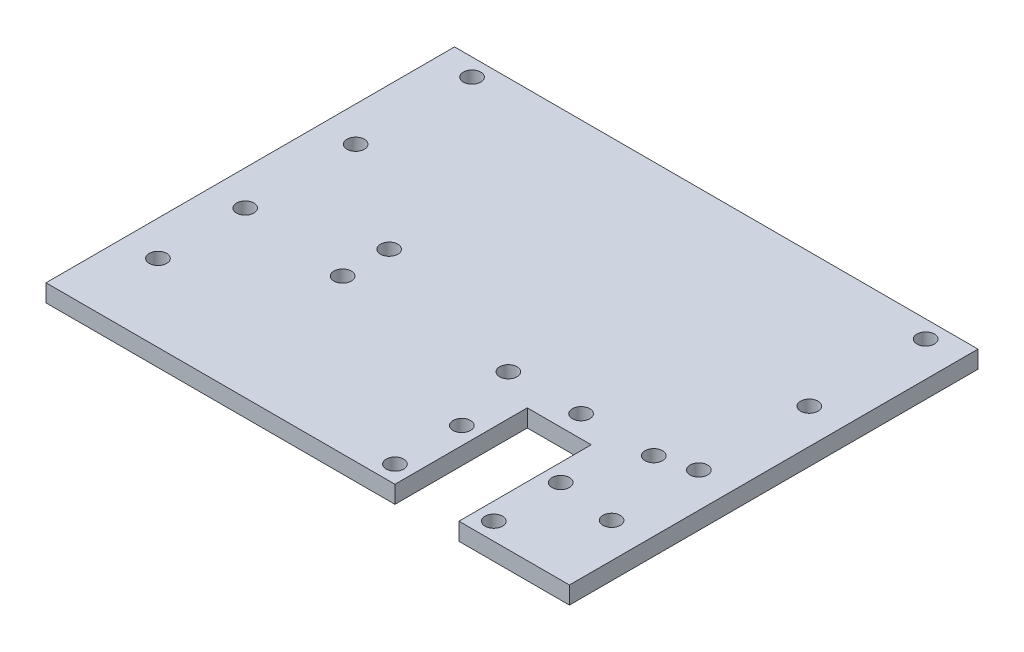
ISO-10303-21;
HEADER;
FILE_DESCRIPTION(('STEP AP214'),'2;1');
FILE_NAME('part.step','',(''),(''),'','','');
FILE_SCHEMA(('AUTOMOTIVE_DESIGN { 1 0 10303 214 1 1 1 1 }'));
ENDSEC;
DATA;
#1=APPLICATION_CONTEXT('core data for automotive mechanical design processes');
#2=APPLICATION_PROTOCOL_DEFINITION('international standard','automotive_design',2000,#1);
#3=PRODUCT_CONTEXT('',#1,'mechanical');
#4=PRODUCT('Part','Part','',(#3));
#5=PRODUCT_RELATED_PRODUCT_CATEGORY('part','',(#4));
#6=PRODUCT_DEFINITION_FORMATION('','',#4);
#7=PRODUCT_DEFINITION_CONTEXT('part definition',#1,'design');
#8=PRODUCT_DEFINITION('design','',#6,#7);
#9=PRODUCT_DEFINITION_SHAPE('','',#8);
#10=(LENGTH_UNIT() NAMED_UNIT(*) SI_UNIT(.MILLI.,.METRE.));
#11=(NAMED_UNIT(*) PLANE_ANGLE_UNIT() SI_UNIT($,.RADIAN.));
#12=(NAMED_UNIT(*) SI_UNIT($,.STERADIAN.) SOLID_ANGLE_UNIT());
#13=UNCERTAINTY_MEASURE_WITH_UNIT(LENGTH_MEASURE(1.E-05),#10,'distance_accuracy_value','');
#14=(GEOMETRIC_REPRESENTATION_CONTEXT(3) GLOBAL_UNCERTAINTY_ASSIGNED_CONTEXT((#13)) GLOBAL_UNIT_ASSIGNED_CONTEXT((#10,
#11,#12)) REPRESENTATION_CONTEXT('',''));
#15=CARTESIAN_POINT('',(0.,0.,0.));
#16=DIRECTION('',(0.,0.,1.));
#17=DIRECTION('',(1.,0.,0.));
#18=AXIS2_PLACEMENT_3D('',#15,#16,#17);
#19=CARTESIAN_POINT('',(15.,3.,0.));
#20=DIRECTION('',(-1.,0.,0.));
#21=DIRECTION('',(0.,0.,1.));
#22=AXIS2_PLACEMENT_3D('',#19,#20,#21);
#23=PLANE('',#22);
#24=DIRECTION('',(0.,0.,-1.));
#25=VECTOR('',#24,1.);
#26=CARTESIAN_POINT('',(15.,3.,0.));
#27=LINE('',#26,#25);
#28=CARTESIAN_POINT('',(15.,3.,23.75));
#29=VERTEX_POINT('',#28);
#30=CARTESIAN_POINT('',(15.,3.,1.));
#31=VERTEX_POINT('',#30);
#32=EDGE_CURVE('E128',#29,#31,#27,.T.);
#33=ORIENTED_EDGE('',*,*,#32,.F.);
#34=DIRECTION('',(0.,-1.,0.));
#35=VECTOR('',#34,1.);
#36=CARTESIAN_POINT('',(15.,3.,23.75));
#37=LINE('',#36,#35);
#38=CARTESIAN_POINT('',(15.,0.,23.75));
#39=VERTEX_POINT('',#38);
#40=EDGE_CURVE('E203',#29,#39,#37,.T.);
#41=ORIENTED_EDGE('',*,*,#40,.T.);
#42=DIRECTION('',(0.,0.,-1.));
#43=VECTOR('',#42,1.);
#44=CARTESIAN_POINT('',(15.,0.,0.));
#45=LINE('',#44,#43);
#46=CARTESIAN_POINT('',(15.,0.,1.));
#47=VERTEX_POINT('',#46);
#48=EDGE_CURVE('E150',#39,#47,#45,.T.);
#49=ORIENTED_EDGE('',*,*,#48,.T.);
#50=DIRECTION('',(0.,-1.,0.));
#51=VECTOR('',#50,1.);
#52=CARTESIAN_POINT('',(15.,3.,1.));
#53=LINE('',#52,#51);
#54=EDGE_CURVE('E44',#31,#47,#53,.T.);
#55=ORIENTED_EDGE('',*,*,#54,.F.);
#56=EDGE_LOOP('',(#33,#41,#49,#55));
#57=FACE_BOUND('',#56,.T.);
#58=ADVANCED_FACE('F37',(#57),#23,.F.);
#59=CARTESIAN_POINT('',(0.,3.,1.00000000000001));
#60=DIRECTION('',(0.,0.,1.));
#61=DIRECTION('',(1.,0.,0.));
#62=AXIS2_PLACEMENT_3D('',#59,#60,#61);
#63=PLANE('',#62);
#64=DIRECTION('',(-1.,0.,0.));
#65=VECTOR('',#64,1.);
#66=CARTESIAN_POINT('',(0.,0.,1.00000000000001));
#67=LINE('',#66,#65);
#68=CARTESIAN_POINT('',(26.,0.,1.));
#69=VERTEX_POINT('',#68);
#70=EDGE_CURVE('E123',#69,#47,#67,.T.);
#71=ORIENTED_EDGE('',*,*,#70,.F.);
#72=DIRECTION('',(0.,-1.,0.));
#73=VECTOR('',#72,1.);
#74=CARTESIAN_POINT('',(26.,3.,1.));
#75=LINE('',#74,#73);
#76=CARTESIAN_POINT('',(26.,3.,1.));
#77=VERTEX_POINT('',#76);
#78=EDGE_CURVE('E135',#77,#69,#75,.T.);
#79=ORIENTED_EDGE('',*,*,#78,.F.);
#80=DIRECTION('',(-1.,0.,0.));
#81=VECTOR('',#80,1.);
#82=CARTESIAN_POINT('',(0.,3.,1.00000000000001));
#83=LINE('',#82,#81);
#84=EDGE_CURVE('E146',#77,#31,#83,.T.);
#85=ORIENTED_EDGE('',*,*,#84,.T.);
#86=ORIENTED_EDGE('',*,*,#54,.T.);
#87=EDGE_LOOP('',(#71,#79,#85,#86));
#88=FACE_BOUND('',#87,.T.);
#89=ADVANCED_FACE('F143',(#88),#63,.T.);
#90=CARTESIAN_POINT('',(26.,3.,0.));
#91=DIRECTION('',(-1.,0.,0.));
#92=DIRECTION('',(0.,0.,1.));
#93=AXIS2_PLACEMENT_3D('',#90,#91,#92);
#94=PLANE('',#93);
#95=DIRECTION('',(0.,-1.,0.));
#96=VECTOR('',#95,1.);
#97=CARTESIAN_POINT('',(26.,3.,23.75));
#98=LINE('',#97,#96);
#99=CARTESIAN_POINT('',(26.,3.,23.75));
#100=VERTEX_POINT('',#99);
#101=CARTESIAN_POINT('',(26.,0.,23.75));
#102=VERTEX_POINT('',#101);
#103=EDGE_CURVE('E51',#100,#102,#98,.T.);
#104=ORIENTED_EDGE('',*,*,#103,.F.);
#105=DIRECTION('',(0.,0.,-1.));
#106=VECTOR('',#105,1.);
#107=CARTESIAN_POINT('',(26.,3.,0.));
#108=LINE('',#107,#106);
#109=EDGE_CURVE('E159',#100,#77,#108,.T.);
#110=ORIENTED_EDGE('',*,*,#109,.T.);
#111=ORIENTED_EDGE('',*,*,#78,.T.);
#112=DIRECTION('',(0.,0.,-1.));
#113=VECTOR('',#112,1.);
#114=CARTESIAN_POINT('',(26.,0.,0.));
#115=LINE('',#114,#113);
#116=EDGE_CURVE('E119',#102,#69,#115,.T.);
#117=ORIENTED_EDGE('',*,*,#116,.F.);
#118=EDGE_LOOP('',(#104,#110,#111,#117));
#119=FACE_BOUND('',#118,.T.);
#120=ADVANCED_FACE('F339',(#119),#94,.T.);
#121=CARTESIAN_POINT('',(45.,3.,0.));
#122=DIRECTION('',(-1.,0.,0.));
#123=DIRECTION('',(0.,0.,1.));
#124=AXIS2_PLACEMENT_3D('',#121,#122,#123);
#125=PLANE('',#124);
#126=DIRECTION('',(0.,0.,-1.));
#127=VECTOR('',#126,1.);
#128=CARTESIAN_POINT('',(45.,3.,0.));
#129=LINE('',#128,#127);
#130=CARTESIAN_POINT('',(45.,3.,23.75));
#131=VERTEX_POINT('',#130);
#132=CARTESIAN_POINT('',(45.,3.,-46.5));
#133=VERTEX_POINT('',#132);
#134=EDGE_CURVE('E113',#131,#133,#129,.T.);
#135=ORIENTED_EDGE('',*,*,#134,.F.);
#136=DIRECTION('',(0.,1.,0.));
#137=VECTOR('',#136,1.);
#138=CARTESIAN_POINT('',(45.,0.,23.75));
#139=LINE('',#138,#137);
#140=CARTESIAN_POINT('',(45.,0.,23.75));
#141=VERTEX_POINT('',#140);
#142=EDGE_CURVE('E100',#141,#131,#139,.T.);
#143=ORIENTED_EDGE('',*,*,#142,.F.);
#144=DIRECTION('',(0.,0.,-1.));
#145=VECTOR('',#144,1.);
#146=CARTESIAN_POINT('',(45.,0.,0.));
#147=LINE('',#146,#145);
#148=CARTESIAN_POINT('',(45.,0.,-46.5));
#149=VERTEX_POINT('',#148);
#150=EDGE_CURVE('E111',#141,#149,#147,.T.);
#151=ORIENTED_EDGE('',*,*,#150,.T.);
#152=DIRECTION('',(0.,-1.,0.));
#153=VECTOR('',#152,1.);
#154=CARTESIAN_POINT('',(45.,3.,-46.5));
#155=LINE('',#154,#153);
#156=EDGE_CURVE('E132',#133,#149,#155,.T.);
#157=ORIENTED_EDGE('',*,*,#156,.F.);
#158=EDGE_LOOP('',(#135,#143,#151,#157));
#159=FACE_BOUND('',#158,.T.);
#160=ADVANCED_FACE('F109',(#159),#125,.F.);
#161=CARTESIAN_POINT('',(0.,3.,-46.5));
#162=DIRECTION('',(0.,0.,-1.));
#163=DIRECTION('',(-1.,0.,0.));
#164=AXIS2_PLACEMENT_3D('',#161,#162,#163);
#165=PLANE('',#164);
#166=DIRECTION('',(1.,0.,0.));
#167=VECTOR('',#166,1.);
#168=CARTESIAN_POINT('',(0.,0.,-46.5));
#169=LINE('',#168,#167);
#170=CARTESIAN_POINT('',(-45.,0.,-46.5));
#171=VERTEX_POINT('',#170);
#172=EDGE_CURVE('E118',#171,#149,#169,.T.);
#173=ORIENTED_EDGE('',*,*,#172,.F.);
#174=DIRECTION('',(0.,-1.,0.));
#175=VECTOR('',#174,1.);
#176=CARTESIAN_POINT('',(-45.,3.,-46.5));
#177=LINE('',#176,#175);
#178=CARTESIAN_POINT('',(-45.,3.,-46.5));
#179=VERTEX_POINT('',#178);
#180=EDGE_CURVE('E129',#179,#171,#177,.T.);
#181=ORIENTED_EDGE('',*,*,#180,.F.);
#182=DIRECTION('',(1.,0.,0.));
#183=VECTOR('',#182,1.);
#184=CARTESIAN_POINT('',(0.,3.,-46.5));
#185=LINE('',#184,#183);
#186=EDGE_CURVE('E155',#179,#133,#185,.T.);
#187=ORIENTED_EDGE('',*,*,#186,.T.);
#188=ORIENTED_EDGE('',*,*,#156,.T.);
#189=EDGE_LOOP('',(#173,#181,#187,#188));
#190=FACE_BOUND('',#189,.T.);
#191=ADVANCED_FACE('F348',(#190),#165,.T.);
#192=CARTESIAN_POINT('',(-45.,3.,0.));
#193=DIRECTION('',(-1.,0.,0.));
#194=DIRECTION('',(0.,0.,1.));
#195=AXIS2_PLACEMENT_3D('',#192,#193,#194);
#196=PLANE('',#195);
#197=DIRECTION('',(0.,1.,0.));
#198=VECTOR('',#197,1.);
#199=CARTESIAN_POINT('',(-45.,0.,23.75));
#200=LINE('',#199,#198);
#201=CARTESIAN_POINT('',(-45.,0.,23.75));
#202=VERTEX_POINT('',#201);
#203=CARTESIAN_POINT('',(-45.,3.,23.75));
#204=VERTEX_POINT('',#203);
#205=EDGE_CURVE('E59',#202,#204,#200,.T.);
#206=ORIENTED_EDGE('',*,*,#205,.T.);
#207=DIRECTION('',(0.,0.,-1.));
#208=VECTOR('',#207,1.);
#209=CARTESIAN_POINT('',(-45.,3.,0.));
#210=LINE('',#209,#208);
#211=EDGE_CURVE('E133',#204,#179,#210,.T.);
#212=ORIENTED_EDGE('',*,*,#211,.T.);
#213=ORIENTED_EDGE('',*,*,#180,.T.);
#214=DIRECTION('',(0.,0.,-1.));
#215=VECTOR('',#214,1.);
#216=CARTESIAN_POINT('',(-45.,0.,0.));
#217=LINE('',#216,#215);
#218=EDGE_CURVE('E121',#202,#171,#217,.T.);
#219=ORIENTED_EDGE('',*,*,#218,.F.);
#220=EDGE_LOOP('',(#206,#212,#213,#219));
#221=FACE_BOUND('',#220,.T.);
#222=ADVANCED_FACE('F284',(#221),#196,.T.);
#223=CARTESIAN_POINT('',(0.,3.,0.));
#224=DIRECTION('',(0.,1.,0.));
#225=DIRECTION('',(0.,0.,1.));
#226=AXIS2_PLACEMENT_3D('',#223,#224,#225);
#227=PLANE('',#226);
#228=CARTESIAN_POINT('',(-20.5,3.,-2.75));
#229=DIRECTION('',(0.,1.,0.));
#230=DIRECTION('',(0.,0.,1.));
#231=AXIS2_PLACEMENT_3D('',#228,#229,#230);
#232=CIRCLE('',#231,1.5);
#233=CARTESIAN_POINT('',(-20.5,3.,-1.25));
#234=VERTEX_POINT('',#233);
#235=EDGE_CURVE('E266',#234,#234,#232,.T.);
#236=ORIENTED_EDGE('',*,*,#235,.F.);
#237=EDGE_LOOP('',(#236));
#238=FACE_BOUND('',#237,.T.);
#239=CARTESIAN_POINT('',(-20.5,3.,-10.75));
#240=DIRECTION('',(0.,1.,0.));
#241=DIRECTION('',(0.,0.,1.));
#242=AXIS2_PLACEMENT_3D('',#239,#240,#241);
#243=CIRCLE('',#242,1.5);
#244=CARTESIAN_POINT('',(-20.5,3.,-9.25));
#245=VERTEX_POINT('',#244);
#246=EDGE_CURVE('E260',#245,#245,#243,.T.);
#247=ORIENTED_EDGE('',*,*,#246,.F.);
#248=EDGE_LOOP('',(#247));
#249=FACE_BOUND('',#248,.T.);
#250=CARTESIAN_POINT('',(-39.,3.,-43.5));
#251=DIRECTION('',(0.,1.,0.));
#252=DIRECTION('',(0.,0.,1.));
#253=AXIS2_PLACEMENT_3D('',#250,#251,#252);
#254=CIRCLE('',#253,1.5);
#255=CARTESIAN_POINT('',(-39.,3.,-42.));
#256=VERTEX_POINT('',#255);
#257=EDGE_CURVE('E255',#256,#256,#254,.T.);
#258=ORIENTED_EDGE('',*,*,#257,.F.);
#259=EDGE_LOOP('',(#258));
#260=FACE_BOUND('',#259,.T.);
#261=CARTESIAN_POINT('',(39.,3.,-43.5));
#262=DIRECTION('',(0.,1.,0.));
#263=DIRECTION('',(0.,0.,1.));
#264=AXIS2_PLACEMENT_3D('',#261,#262,#263);
#265=CIRCLE('',#264,1.5);
#266=CARTESIAN_POINT('',(39.,3.,-42.));
#267=VERTEX_POINT('',#266);
#268=EDGE_CURVE('E248',#267,#267,#265,.T.);
#269=ORIENTED_EDGE('',*,*,#268,.F.);
#270=EDGE_LOOP('',(#269));
#271=FACE_BOUND('',#270,.T.);
#272=CARTESIAN_POINT('',(-39.,3.,-23.5));
#273=DIRECTION('',(0.,1.,0.));
#274=DIRECTION('',(0.,0.,1.));
#275=AXIS2_PLACEMENT_3D('',#272,#273,#274);
#276=CIRCLE('',#275,1.5);
#277=CARTESIAN_POINT('',(-39.,3.,-22.));
#278=VERTEX_POINT('',#277);
#279=EDGE_CURVE('E243',#278,#278,#276,.T.);
#280=ORIENTED_EDGE('',*,*,#279,.F.);
#281=EDGE_LOOP('',(#280));
#282=FACE_BOUND('',#281,.T.);
#283=CARTESIAN_POINT('',(39.,3.,-23.5));
#284=DIRECTION('',(0.,1.,0.));
#285=DIRECTION('',(0.,0.,1.));
#286=AXIS2_PLACEMENT_3D('',#283,#284,#285);
#287=CIRCLE('',#286,1.5);
#288=CARTESIAN_POINT('',(39.,3.,-22.));
#289=VERTEX_POINT('',#288);
#290=EDGE_CURVE('E236',#289,#289,#287,.T.);
#291=ORIENTED_EDGE('',*,*,#290,.F.);
#292=EDGE_LOOP('',(#291));
#293=FACE_BOUND('',#292,.T.);
#294=CARTESIAN_POINT('',(7.99999999999999,3.,-2.75));
#295=DIRECTION('',(0.,1.,0.));
#296=DIRECTION('',(0.,0.,1.));
#297=AXIS2_PLACEMENT_3D('',#294,#295,#296);
#298=CIRCLE('',#297,1.5);
#299=CARTESIAN_POINT('',(7.99999999999999,3.,-1.24999999999999));
#300=VERTEX_POINT('',#299);
#301=EDGE_CURVE('E217',#300,#300,#298,.T.);
#302=ORIENTED_EDGE('',*,*,#301,.F.);
#303=EDGE_LOOP('',(#302));
#304=FACE_BOUND('',#303,.T.);
#305=CARTESIAN_POINT('',(33.,3.,-2.75));
#306=DIRECTION('',(0.,1.,0.));
#307=DIRECTION('',(0.,0.,1.));
#308=AXIS2_PLACEMENT_3D('',#305,#306,#307);
#309=CIRCLE('',#308,1.5);
#310=CARTESIAN_POINT('',(33.,3.,-1.25));
#311=VERTEX_POINT('',#310);
#312=EDGE_CURVE('E220',#311,#311,#309,.T.);
#313=ORIENTED_EDGE('',*,*,#312,.F.);
#314=EDGE_LOOP('',(#313));
#315=FACE_BOUND('',#314,.T.);
#316=CARTESIAN_POINT('',(20.5,3.,-2.75));
#317=DIRECTION('',(0.,1.,0.));
#318=DIRECTION('',(0.,0.,1.));
#319=AXIS2_PLACEMENT_3D('',#316,#317,#318);
#320=CIRCLE('',#319,1.5);
#321=CARTESIAN_POINT('',(20.5,3.,-1.25));
#322=VERTEX_POINT('',#321);
#323=EDGE_CURVE('E223',#322,#322,#320,.T.);
#324=ORIENTED_EDGE('',*,*,#323,.F.);
#325=EDGE_LOOP('',(#324));
#326=FACE_BOUND('',#325,.T.);
#327=DIRECTION('',(-1.,0.,0.));
#328=VECTOR('',#327,1.);
#329=CARTESIAN_POINT('',(45.,3.,23.75));
#330=LINE('',#329,#328);
#331=EDGE_CURVE('E105',#131,#100,#330,.T.);
#332=ORIENTED_EDGE('',*,*,#331,.F.);
#333=ORIENTED_EDGE('',*,*,#134,.T.);
#334=ORIENTED_EDGE('',*,*,#186,.F.);
#335=ORIENTED_EDGE('',*,*,#211,.F.);
#336=EDGE_CURVE('E215',#29,#204,#330,.T.);
#337=ORIENTED_EDGE('',*,*,#336,.F.);
#338=ORIENTED_EDGE('',*,*,#32,.T.);
#339=ORIENTED_EDGE('',*,*,#84,.F.);
#340=ORIENTED_EDGE('',*,*,#109,.F.);
#341=EDGE_LOOP('',(#332,#333,#334,#335,#337,#338,#339,#340));
#342=FACE_BOUND('',#341,.T.);
#343=CARTESIAN_POINT('',(12.,3.,9.25));
#344=DIRECTION('',(0.,1.,0.));
#345=DIRECTION('',(0.,0.,1.));
#346=AXIS2_PLACEMENT_3D('',#343,#344,#345);
#347=CIRCLE('',#346,1.5);
#348=CARTESIAN_POINT('',(12.,3.,10.75));
#349=VERTEX_POINT('',#348);
#350=EDGE_CURVE('E206',#349,#349,#347,.T.);
#351=ORIENTED_EDGE('',*,*,#350,.F.);
#352=EDGE_LOOP('',(#351));
#353=FACE_BOUND('',#352,.T.);
#354=CARTESIAN_POINT('',(29.,3.,9.25));
#355=DIRECTION('',(0.,1.,0.));
#356=DIRECTION('',(0.,0.,1.));
#357=AXIS2_PLACEMENT_3D('',#354,#355,#356);
#358=CIRCLE('',#357,1.5);
#359=CARTESIAN_POINT('',(29.,3.,10.75));
#360=VERTEX_POINT('',#359);
#361=EDGE_CURVE('E199',#360,#360,#358,.T.);
#362=ORIENTED_EDGE('',*,*,#361,.F.);
#363=EDGE_LOOP('',(#362));
#364=FACE_BOUND('',#363,.T.);
#365=CARTESIAN_POINT('',(29.,3.,20.75));
#366=DIRECTION('',(0.,1.,0.));
#367=DIRECTION('',(0.,0.,1.));
#368=AXIS2_PLACEMENT_3D('',#365,#366,#367);
#369=CIRCLE('',#368,1.5);
#370=CARTESIAN_POINT('',(29.,3.,22.25));
#371=VERTEX_POINT('',#370);
#372=EDGE_CURVE('E194',#371,#371,#369,.T.);
#373=ORIENTED_EDGE('',*,*,#372,.F.);
#374=EDGE_LOOP('',(#373));
#375=FACE_BOUND('',#374,.T.);
#376=CARTESIAN_POINT('',(12.,3.,20.75));
#377=DIRECTION('',(0.,1.,0.));
#378=DIRECTION('',(0.,0.,1.));
#379=AXIS2_PLACEMENT_3D('',#376,#377,#378);
#380=CIRCLE('',#379,1.5);
#381=CARTESIAN_POINT('',(12.,3.,22.25));
#382=VERTEX_POINT('',#381);
#383=EDGE_CURVE('E187',#382,#382,#380,.T.);
#384=ORIENTED_EDGE('',*,*,#383,.F.);
#385=EDGE_LOOP('',(#384));
#386=FACE_BOUND('',#385,.T.);
#387=CARTESIAN_POINT('',(39.,3.,10.5));
#388=DIRECTION('',(0.,1.,0.));
#389=DIRECTION('',(0.,0.,1.));
#390=AXIS2_PLACEMENT_3D('',#387,#388,#389);
#391=CIRCLE('',#390,1.5);
#392=CARTESIAN_POINT('',(39.,3.,12.));
#393=VERTEX_POINT('',#392);
#394=EDGE_CURVE('E176',#393,#393,#391,.T.);
#395=ORIENTED_EDGE('',*,*,#394,.F.);
#396=EDGE_LOOP('',(#395));
#397=FACE_BOUND('',#396,.T.);
#398=CARTESIAN_POINT('',(-39.,3.,-4.5));
#399=DIRECTION('',(0.,1.,0.));
#400=DIRECTION('',(0.,0.,1.));
#401=AXIS2_PLACEMENT_3D('',#398,#399,#400);
#402=CIRCLE('',#401,1.5);
#403=CARTESIAN_POINT('',(-39.,3.,-2.99999999999999));
#404=VERTEX_POINT('',#403);
#405=EDGE_CURVE('E169',#404,#404,#402,.T.);
#406=ORIENTED_EDGE('',*,*,#405,.F.);
#407=EDGE_LOOP('',(#406));
#408=FACE_BOUND('',#407,.T.);
#409=CARTESIAN_POINT('',(-39.,3.,10.5));
#410=DIRECTION('',(0.,1.,0.));
#411=DIRECTION('',(0.,0.,1.));
#412=AXIS2_PLACEMENT_3D('',#409,#410,#411);
#413=CIRCLE('',#412,1.5);
#414=CARTESIAN_POINT('',(-39.,3.,12.));
#415=VERTEX_POINT('',#414);
#416=EDGE_CURVE('E181',#415,#415,#413,.T.);
#417=ORIENTED_EDGE('',*,*,#416,.F.);
#418=EDGE_LOOP('',(#417));
#419=FACE_BOUND('',#418,.T.);
#420=CARTESIAN_POINT('',(39.,3.,-4.50000000000001));
#421=DIRECTION('',(0.,1.,0.));
#422=DIRECTION('',(0.,0.,1.));
#423=AXIS2_PLACEMENT_3D('',#420,#421,#422);
#424=CIRCLE('',#423,1.5);
#425=CARTESIAN_POINT('',(39.,3.,-3.00000000000001));
#426=VERTEX_POINT('',#425);
#427=EDGE_CURVE('E163',#426,#426,#424,.T.);
#428=ORIENTED_EDGE('',*,*,#427,.F.);
#429=EDGE_LOOP('',(#428));
#430=FACE_BOUND('',#429,.T.);
#431=ADVANCED_FACE('F281',(#238,#249,#260,#271,#282,#293,#304,#315,#326,#342,#353,#364,#375,
#386,#397,#408,#419,#430),#227,.T.);
#432=CARTESIAN_POINT('',(0.,0.,0.));
#433=DIRECTION('',(0.,1.,0.));
#434=DIRECTION('',(0.,0.,1.));
#435=AXIS2_PLACEMENT_3D('',#432,#433,#434);
#436=PLANE('',#435);
#437=CARTESIAN_POINT('',(-20.5,0.,-2.75));
#438=DIRECTION('',(0.,1.,0.));
#439=DIRECTION('',(0.,0.,1.));
#440=AXIS2_PLACEMENT_3D('',#437,#438,#439);
#441=CIRCLE('',#440,1.5);
#442=CARTESIAN_POINT('',(-20.5,0.,-1.25));
#443=VERTEX_POINT('',#442);
#444=EDGE_CURVE('E252',#443,#443,#441,.T.);
#445=ORIENTED_EDGE('',*,*,#444,.T.);
#446=EDGE_LOOP('',(#445));
#447=FACE_BOUND('',#446,.T.);
#448=CARTESIAN_POINT('',(-20.5,0.,-10.75));
#449=DIRECTION('',(0.,1.,0.));
#450=DIRECTION('',(0.,0.,1.));
#451=AXIS2_PLACEMENT_3D('',#448,#449,#450);
#452=CIRCLE('',#451,1.5);
#453=CARTESIAN_POINT('',(-20.5,0.,-9.25));
#454=VERTEX_POINT('',#453);
#455=EDGE_CURVE('E263',#454,#454,#452,.T.);
#456=ORIENTED_EDGE('',*,*,#455,.T.);
#457=EDGE_LOOP('',(#456));
#458=FACE_BOUND('',#457,.T.);
#459=CARTESIAN_POINT('',(-39.,0.,-43.5));
#460=DIRECTION('',(0.,1.,0.));
#461=DIRECTION('',(0.,0.,1.));
#462=AXIS2_PLACEMENT_3D('',#459,#460,#461);
#463=CIRCLE('',#462,1.5);
#464=CARTESIAN_POINT('',(-39.,0.,-42.));
#465=VERTEX_POINT('',#464);
#466=EDGE_CURVE('E240',#465,#465,#463,.T.);
#467=ORIENTED_EDGE('',*,*,#466,.T.);
#468=EDGE_LOOP('',(#467));
#469=FACE_BOUND('',#468,.T.);
#470=CARTESIAN_POINT('',(39.,0.,-43.5));
#471=DIRECTION('',(0.,1.,0.));
#472=DIRECTION('',(0.,0.,1.));
#473=AXIS2_PLACEMENT_3D('',#470,#471,#472);
#474=CIRCLE('',#473,1.5);
#475=CARTESIAN_POINT('',(39.,0.,-42.));
#476=VERTEX_POINT('',#475);
#477=EDGE_CURVE('E251',#476,#476,#474,.T.);
#478=ORIENTED_EDGE('',*,*,#477,.T.);
#479=EDGE_LOOP('',(#478));
#480=FACE_BOUND('',#479,.T.);
#481=CARTESIAN_POINT('',(-39.,0.,-23.5));
#482=DIRECTION('',(0.,1.,0.));
#483=DIRECTION('',(0.,0.,1.));
#484=AXIS2_PLACEMENT_3D('',#481,#482,#483);
#485=CIRCLE('',#484,1.5);
#486=CARTESIAN_POINT('',(-39.,0.,-22.));
#487=VERTEX_POINT('',#486);
#488=EDGE_CURVE('E233',#487,#487,#485,.T.);
#489=ORIENTED_EDGE('',*,*,#488,.T.);
#490=EDGE_LOOP('',(#489));
#491=FACE_BOUND('',#490,.T.);
#492=CARTESIAN_POINT('',(39.,0.,-23.5));
#493=DIRECTION('',(0.,1.,0.));
#494=DIRECTION('',(0.,0.,1.));
#495=AXIS2_PLACEMENT_3D('',#492,#493,#494);
#496=CIRCLE('',#495,1.5);
#497=CARTESIAN_POINT('',(39.,0.,-22.));
#498=VERTEX_POINT('',#497);
#499=EDGE_CURVE('E239',#498,#498,#496,.T.);
#500=ORIENTED_EDGE('',*,*,#499,.T.);
#501=EDGE_LOOP('',(#500));
#502=FACE_BOUND('',#501,.T.);
#503=CARTESIAN_POINT('',(7.99999999999999,0.,-2.75));
#504=DIRECTION('',(0.,1.,0.));
#505=DIRECTION('',(0.,0.,-1.));
#506=AXIS2_PLACEMENT_3D('',#503,#504,#505);
#507=CIRCLE('',#506,1.5);
#508=CARTESIAN_POINT('',(7.99999999999999,0.,-4.25));
#509=VERTEX_POINT('',#508);
#510=EDGE_CURVE('E230',#509,#509,#507,.T.);
#511=ORIENTED_EDGE('',*,*,#510,.T.);
#512=EDGE_LOOP('',(#511));
#513=FACE_BOUND('',#512,.T.);
#514=CARTESIAN_POINT('',(33.,0.,-2.75));
#515=DIRECTION('',(0.,1.,0.));
#516=DIRECTION('',(0.,0.,1.));
#517=AXIS2_PLACEMENT_3D('',#514,#515,#516);
#518=CIRCLE('',#517,1.5);
#519=CARTESIAN_POINT('',(33.,0.,-1.25));
#520=VERTEX_POINT('',#519);
#521=EDGE_CURVE('E229',#520,#520,#518,.T.);
#522=ORIENTED_EDGE('',*,*,#521,.T.);
#523=EDGE_LOOP('',(#522));
#524=FACE_BOUND('',#523,.T.);
#525=CARTESIAN_POINT('',(20.5,0.,-2.75));
#526=DIRECTION('',(0.,1.,0.));
#527=DIRECTION('',(0.,0.,1.));
#528=AXIS2_PLACEMENT_3D('',#525,#526,#527);
#529=CIRCLE('',#528,1.5);
#530=CARTESIAN_POINT('',(20.5,0.,-1.25));
#531=VERTEX_POINT('',#530);
#532=EDGE_CURVE('E226',#531,#531,#529,.T.);
#533=ORIENTED_EDGE('',*,*,#532,.T.);
#534=EDGE_LOOP('',(#533));
#535=FACE_BOUND('',#534,.T.);
#536=CARTESIAN_POINT('',(12.,0.,9.25));
#537=DIRECTION('',(0.,1.,0.));
#538=DIRECTION('',(0.,0.,1.));
#539=AXIS2_PLACEMENT_3D('',#536,#537,#538);
#540=CIRCLE('',#539,1.5);
#541=CARTESIAN_POINT('',(12.,0.,10.75));
#542=VERTEX_POINT('',#541);
#543=EDGE_CURVE('E191',#542,#542,#540,.T.);
#544=ORIENTED_EDGE('',*,*,#543,.T.);
#545=EDGE_LOOP('',(#544));
#546=FACE_BOUND('',#545,.T.);
#547=CARTESIAN_POINT('',(29.,0.,9.25));
#548=DIRECTION('',(0.,1.,0.));
#549=DIRECTION('',(0.,0.,1.));
#550=AXIS2_PLACEMENT_3D('',#547,#548,#549);
#551=CIRCLE('',#550,1.5);
#552=CARTESIAN_POINT('',(29.,0.,10.75));
#553=VERTEX_POINT('',#552);
#554=EDGE_CURVE('E202',#553,#553,#551,.T.);
#555=ORIENTED_EDGE('',*,*,#554,.T.);
#556=EDGE_LOOP('',(#555));
#557=FACE_BOUND('',#556,.T.);
#558=CARTESIAN_POINT('',(29.,0.,20.75));
#559=DIRECTION('',(0.,1.,0.));
#560=DIRECTION('',(0.,0.,1.));
#561=AXIS2_PLACEMENT_3D('',#558,#559,#560);
#562=CIRCLE('',#561,1.5);
#563=CARTESIAN_POINT('',(29.,0.,22.25));
#564=VERTEX_POINT('',#563);
#565=EDGE_CURVE('E184',#564,#564,#562,.T.);
#566=ORIENTED_EDGE('',*,*,#565,.T.);
#567=EDGE_LOOP('',(#566));
#568=FACE_BOUND('',#567,.T.);
#569=CARTESIAN_POINT('',(12.,0.,20.75));
#570=DIRECTION('',(0.,1.,0.));
#571=DIRECTION('',(0.,0.,1.));
#572=AXIS2_PLACEMENT_3D('',#569,#570,#571);
#573=CIRCLE('',#572,1.5);
#574=CARTESIAN_POINT('',(12.,0.,22.25));
#575=VERTEX_POINT('',#574);
#576=EDGE_CURVE('E190',#575,#575,#573,.T.);
#577=ORIENTED_EDGE('',*,*,#576,.T.);
#578=EDGE_LOOP('',(#577));
#579=FACE_BOUND('',#578,.T.);
#580=CARTESIAN_POINT('',(39.,0.,10.5));
#581=DIRECTION('',(0.,1.,0.));
#582=DIRECTION('',(0.,0.,1.));
#583=AXIS2_PLACEMENT_3D('',#580,#581,#582);
#584=CIRCLE('',#583,1.5);
#585=CARTESIAN_POINT('',(39.,0.,12.));
#586=VERTEX_POINT('',#585);
#587=EDGE_CURVE('E166',#586,#586,#584,.T.);
#588=ORIENTED_EDGE('',*,*,#587,.T.);
#589=EDGE_LOOP('',(#588));
#590=FACE_BOUND('',#589,.T.);
#591=CARTESIAN_POINT('',(-39.,0.,-4.5));
#592=DIRECTION('',(0.,1.,0.));
#593=DIRECTION('',(0.,0.,1.));
#594=AXIS2_PLACEMENT_3D('',#591,#592,#593);
#595=CIRCLE('',#594,1.5);
#596=CARTESIAN_POINT('',(-39.,0.,-2.99999999999999));
#597=VERTEX_POINT('',#596);
#598=EDGE_CURVE('E172',#597,#597,#595,.T.);
#599=ORIENTED_EDGE('',*,*,#598,.T.);
#600=EDGE_LOOP('',(#599));
#601=FACE_BOUND('',#600,.T.);
#602=CARTESIAN_POINT('',(-39.,0.,10.5));
#603=DIRECTION('',(0.,1.,0.));
#604=DIRECTION('',(0.,0.,1.));
#605=AXIS2_PLACEMENT_3D('',#602,#603,#604);
#606=CIRCLE('',#605,1.5);
#607=CARTESIAN_POINT('',(-39.,0.,12.));
#608=VERTEX_POINT('',#607);
#609=EDGE_CURVE('E173',#608,#608,#606,.T.);
#610=ORIENTED_EDGE('',*,*,#609,.T.);
#611=EDGE_LOOP('',(#610));
#612=FACE_BOUND('',#611,.T.);
#613=CARTESIAN_POINT('',(39.,0.,-4.50000000000001));
#614=DIRECTION('',(0.,1.,0.));
#615=DIRECTION('',(0.,0.,1.));
#616=AXIS2_PLACEMENT_3D('',#613,#614,#615);
#617=CIRCLE('',#616,1.5);
#618=CARTESIAN_POINT('',(39.,0.,-3.00000000000001));
#619=VERTEX_POINT('',#618);
#620=EDGE_CURVE('E151',#619,#619,#617,.T.);
#621=ORIENTED_EDGE('',*,*,#620,.T.);
#622=EDGE_LOOP('',(#621));
#623=FACE_BOUND('',#622,.T.);
#624=ORIENTED_EDGE('',*,*,#150,.F.);
#625=DIRECTION('',(-1.,0.,0.));
#626=VECTOR('',#625,1.);
#627=CARTESIAN_POINT('',(45.,0.,23.75));
#628=LINE('',#627,#626);
#629=EDGE_CURVE('E97',#141,#102,#628,.T.);
#630=ORIENTED_EDGE('',*,*,#629,.T.);
#631=ORIENTED_EDGE('',*,*,#116,.T.);
#632=ORIENTED_EDGE('',*,*,#70,.T.);
#633=ORIENTED_EDGE('',*,*,#48,.F.);
#634=DIRECTION('',(-1.,0.,0.));
#635=VECTOR('',#634,1.);
#636=CARTESIAN_POINT('',(0.,0.,23.75));
#637=LINE('',#636,#635);
#638=EDGE_CURVE('E11',#39,#202,#637,.T.);
#639=ORIENTED_EDGE('',*,*,#638,.T.);
#640=ORIENTED_EDGE('',*,*,#218,.T.);
#641=ORIENTED_EDGE('',*,*,#172,.T.);
#642=EDGE_LOOP('',(#624,#630,#631,#632,#633,#639,#640,#641));
#643=FACE_BOUND('',#642,.T.);
#644=ADVANCED_FACE('F116',(#447,#458,#469,#480,#491,#502,#513,#524,#535,#546,#557,#568,#579,
#590,#601,#612,#623,#643),#436,.F.);
#645=CARTESIAN_POINT('',(39.,0.,-4.50000000000001));
#646=DIRECTION('',(0.,1.,0.));
#647=DIRECTION('',(0.,0.,1.));
#648=AXIS2_PLACEMENT_3D('',#645,#646,#647);
#649=CYLINDRICAL_SURFACE('',#648,1.5);
#650=ORIENTED_EDGE('',*,*,#620,.F.);
#651=EDGE_LOOP('',(#650));
#652=FACE_BOUND('',#651,.T.);
#653=ORIENTED_EDGE('',*,*,#427,.T.);
#654=EDGE_LOOP('',(#653));
#655=FACE_BOUND('',#654,.T.);
#656=ADVANCED_FACE('F320',(#652,#655),#649,.F.);
#657=CARTESIAN_POINT('',(-39.,0.,10.5));
#658=DIRECTION('',(0.,1.,0.));
#659=DIRECTION('',(0.,0.,1.));
#660=AXIS2_PLACEMENT_3D('',#657,#658,#659);
#661=CYLINDRICAL_SURFACE('',#660,1.5);
#662=ORIENTED_EDGE('',*,*,#609,.F.);
#663=EDGE_LOOP('',(#662));
#664=FACE_BOUND('',#663,.T.);
#665=ORIENTED_EDGE('',*,*,#416,.T.);
#666=EDGE_LOOP('',(#665));
#667=FACE_BOUND('',#666,.T.);
#668=ADVANCED_FACE('F322',(#664,#667),#661,.F.);
#669=CARTESIAN_POINT('',(-39.,0.,-4.5));
#670=DIRECTION('',(0.,1.,0.));
#671=DIRECTION('',(0.,0.,1.));
#672=AXIS2_PLACEMENT_3D('',#669,#670,#671);
#673=CYLINDRICAL_SURFACE('',#672,1.5);
#674=ORIENTED_EDGE('',*,*,#598,.F.);
#675=EDGE_LOOP('',(#674));
#676=FACE_BOUND('',#675,.T.);
#677=ORIENTED_EDGE('',*,*,#405,.T.);
#678=EDGE_LOOP('',(#677));
#679=FACE_BOUND('',#678,.T.);
#680=ADVANCED_FACE('F329',(#676,#679),#673,.F.);
#681=CARTESIAN_POINT('',(39.,0.,10.5));
#682=DIRECTION('',(0.,1.,0.));
#683=DIRECTION('',(0.,0.,1.));
#684=AXIS2_PLACEMENT_3D('',#681,#682,#683);
#685=CYLINDRICAL_SURFACE('',#684,1.5);
#686=ORIENTED_EDGE('',*,*,#587,.F.);
#687=EDGE_LOOP('',(#686));
#688=FACE_BOUND('',#687,.T.);
#689=ORIENTED_EDGE('',*,*,#394,.T.);
#690=EDGE_LOOP('',(#689));
#691=FACE_BOUND('',#690,.T.);
#692=ADVANCED_FACE('F510',(#688,#691),#685,.F.);
#693=CARTESIAN_POINT('',(12.,0.,20.75));
#694=DIRECTION('',(0.,1.,0.));
#695=DIRECTION('',(0.,0.,1.));
#696=AXIS2_PLACEMENT_3D('',#693,#694,#695);
#697=CYLINDRICAL_SURFACE('',#696,1.5);
#698=ORIENTED_EDGE('',*,*,#576,.F.);
#699=EDGE_LOOP('',(#698));
#700=FACE_BOUND('',#699,.T.);
#701=ORIENTED_EDGE('',*,*,#383,.T.);
#702=EDGE_LOOP('',(#701));
#703=FACE_BOUND('',#702,.T.);
#704=ADVANCED_FACE('F507',(#700,#703),#697,.F.);
#705=CARTESIAN_POINT('',(29.,0.,20.75));
#706=DIRECTION('',(0.,1.,0.));
#707=DIRECTION('',(0.,0.,1.));
#708=AXIS2_PLACEMENT_3D('',#705,#706,#707);
#709=CYLINDRICAL_SURFACE('',#708,1.5);
#710=ORIENTED_EDGE('',*,*,#565,.F.);
#711=EDGE_LOOP('',(#710));
#712=FACE_BOUND('',#711,.T.);
#713=ORIENTED_EDGE('',*,*,#372,.T.);
#714=EDGE_LOOP('',(#713));
#715=FACE_BOUND('',#714,.T.);
#716=ADVANCED_FACE('F503',(#712,#715),#709,.F.);
#717=CARTESIAN_POINT('',(29.,0.,9.25));
#718=DIRECTION('',(0.,1.,0.));
#719=DIRECTION('',(0.,0.,1.));
#720=AXIS2_PLACEMENT_3D('',#717,#718,#719);
#721=CYLINDRICAL_SURFACE('',#720,1.5);
#722=ORIENTED_EDGE('',*,*,#554,.F.);
#723=EDGE_LOOP('',(#722));
#724=FACE_BOUND('',#723,.T.);
#725=ORIENTED_EDGE('',*,*,#361,.T.);
#726=EDGE_LOOP('',(#725));
#727=FACE_BOUND('',#726,.T.);
#728=ADVANCED_FACE('F499',(#724,#727),#721,.F.);
#729=CARTESIAN_POINT('',(12.,0.,9.25));
#730=DIRECTION('',(0.,1.,0.));
#731=DIRECTION('',(0.,0.,1.));
#732=AXIS2_PLACEMENT_3D('',#729,#730,#731);
#733=CYLINDRICAL_SURFACE('',#732,1.5);
#734=ORIENTED_EDGE('',*,*,#543,.F.);
#735=EDGE_LOOP('',(#734));
#736=FACE_BOUND('',#735,.T.);
#737=ORIENTED_EDGE('',*,*,#350,.T.);
#738=EDGE_LOOP('',(#737));
#739=FACE_BOUND('',#738,.T.);
#740=ADVANCED_FACE('F385',(#736,#739),#733,.F.);
#741=CARTESIAN_POINT('',(45.,0.,23.75));
#742=DIRECTION('',(0.,0.,-1.));
#743=DIRECTION('',(-1.,0.,0.));
#744=AXIS2_PLACEMENT_3D('',#741,#742,#743);
#745=PLANE('',#744);
#746=ORIENTED_EDGE('',*,*,#336,.T.);
#747=ORIENTED_EDGE('',*,*,#205,.F.);
#748=ORIENTED_EDGE('',*,*,#638,.F.);
#749=ORIENTED_EDGE('',*,*,#40,.F.);
#750=EDGE_LOOP('',(#746,#747,#748,#749));
#751=FACE_BOUND('',#750,.T.);
#752=ADVANCED_FACE('F343',(#751),#745,.F.);
#753=ORIENTED_EDGE('',*,*,#103,.T.);
#754=ORIENTED_EDGE('',*,*,#629,.F.);
#755=ORIENTED_EDGE('',*,*,#142,.T.);
#756=ORIENTED_EDGE('',*,*,#331,.T.);
#757=EDGE_LOOP('',(#753,#754,#755,#756));
#758=FACE_BOUND('',#757,.T.);
#759=ADVANCED_FACE('F99',(#758),#745,.F.);
#760=CARTESIAN_POINT('',(20.5,0.,-2.75));
#761=DIRECTION('',(0.,1.,0.));
#762=DIRECTION('',(0.,0.,1.));
#763=AXIS2_PLACEMENT_3D('',#760,#761,#762);
#764=CYLINDRICAL_SURFACE('',#763,1.5);
#765=ORIENTED_EDGE('',*,*,#323,.T.);
#766=EDGE_LOOP('',(#765));
#767=FACE_BOUND('',#766,.T.);
#768=ORIENTED_EDGE('',*,*,#532,.F.);
#769=EDGE_LOOP('',(#768));
#770=FACE_BOUND('',#769,.T.);
#771=ADVANCED_FACE('F396',(#767,#770),#764,.F.);
#772=CARTESIAN_POINT('',(33.,0.,-2.75));
#773=DIRECTION('',(0.,1.,0.));
#774=DIRECTION('',(0.,0.,1.));
#775=AXIS2_PLACEMENT_3D('',#772,#773,#774);
#776=CYLINDRICAL_SURFACE('',#775,1.5);
#777=ORIENTED_EDGE('',*,*,#312,.T.);
#778=EDGE_LOOP('',(#777));
#779=FACE_BOUND('',#778,.T.);
#780=ORIENTED_EDGE('',*,*,#521,.F.);
#781=EDGE_LOOP('',(#780));
#782=FACE_BOUND('',#781,.T.);
#783=ADVANCED_FACE('F404',(#779,#782),#776,.F.);
#784=CARTESIAN_POINT('',(7.99999999999999,0.,-2.75));
#785=DIRECTION('',(0.,1.,0.));
#786=DIRECTION('',(0.,0.,1.));
#787=AXIS2_PLACEMENT_3D('',#784,#785,#786);
#788=CYLINDRICAL_SURFACE('',#787,1.5);
#789=ORIENTED_EDGE('',*,*,#301,.T.);
#790=EDGE_LOOP('',(#789));
#791=FACE_BOUND('',#790,.T.);
#792=ORIENTED_EDGE('',*,*,#510,.F.);
#793=EDGE_LOOP('',(#792));
#794=FACE_BOUND('',#793,.T.);
#795=ADVANCED_FACE('F414',(#791,#794),#788,.F.);
#796=CARTESIAN_POINT('',(39.,0.,-23.5));
#797=DIRECTION('',(0.,1.,0.));
#798=DIRECTION('',(0.,0.,1.));
#799=AXIS2_PLACEMENT_3D('',#796,#797,#798);
#800=CYLINDRICAL_SURFACE('',#799,1.5);
#801=ORIENTED_EDGE('',*,*,#499,.F.);
#802=EDGE_LOOP('',(#801));
#803=FACE_BOUND('',#802,.T.);
#804=ORIENTED_EDGE('',*,*,#290,.T.);
#805=EDGE_LOOP('',(#804));
#806=FACE_BOUND('',#805,.T.);
#807=ADVANCED_FACE('F424',(#803,#806),#800,.F.);
#808=CARTESIAN_POINT('',(-39.,0.,-23.5));
#809=DIRECTION('',(0.,1.,0.));
#810=DIRECTION('',(0.,0.,1.));
#811=AXIS2_PLACEMENT_3D('',#808,#809,#810);
#812=CYLINDRICAL_SURFACE('',#811,1.5);
#813=ORIENTED_EDGE('',*,*,#488,.F.);
#814=EDGE_LOOP('',(#813));
#815=FACE_BOUND('',#814,.T.);
#816=ORIENTED_EDGE('',*,*,#279,.T.);
#817=EDGE_LOOP('',(#816));
#818=FACE_BOUND('',#817,.T.);
#819=ADVANCED_FACE('F434',(#815,#818),#812,.F.);
#820=CARTESIAN_POINT('',(39.,0.,-43.5));
#821=DIRECTION('',(0.,1.,0.));
#822=DIRECTION('',(0.,0.,1.));
#823=AXIS2_PLACEMENT_3D('',#820,#821,#822);
#824=CYLINDRICAL_SURFACE('',#823,1.5);
#825=ORIENTED_EDGE('',*,*,#477,.F.);
#826=EDGE_LOOP('',(#825));
#827=FACE_BOUND('',#826,.T.);
#828=ORIENTED_EDGE('',*,*,#268,.T.);
#829=EDGE_LOOP('',(#828));
#830=FACE_BOUND('',#829,.T.);
#831=ADVANCED_FACE('F444',(#827,#830),#824,.F.);
#832=CARTESIAN_POINT('',(-39.,0.,-43.5));
#833=DIRECTION('',(0.,1.,0.));
#834=DIRECTION('',(0.,0.,1.));
#835=AXIS2_PLACEMENT_3D('',#832,#833,#834);
#836=CYLINDRICAL_SURFACE('',#835,1.5);
#837=ORIENTED_EDGE('',*,*,#466,.F.);
#838=EDGE_LOOP('',(#837));
#839=FACE_BOUND('',#838,.T.);
#840=ORIENTED_EDGE('',*,*,#257,.T.);
#841=EDGE_LOOP('',(#840));
#842=FACE_BOUND('',#841,.T.);
#843=ADVANCED_FACE('F454',(#839,#842),#836,.F.);
#844=CARTESIAN_POINT('',(-20.5,0.,-10.75));
#845=DIRECTION('',(0.,1.,0.));
#846=DIRECTION('',(0.,0.,1.));
#847=AXIS2_PLACEMENT_3D('',#844,#845,#846);
#848=CYLINDRICAL_SURFACE('',#847,1.5);
#849=ORIENTED_EDGE('',*,*,#455,.F.);
#850=EDGE_LOOP('',(#849));
#851=FACE_BOUND('',#850,.T.);
#852=ORIENTED_EDGE('',*,*,#246,.T.);
#853=EDGE_LOOP('',(#852));
#854=FACE_BOUND('',#853,.T.);
#855=ADVANCED_FACE('F277',(#851,#854),#848,.F.);
#856=CARTESIAN_POINT('',(-20.5,0.,-2.75));
#857=DIRECTION('',(0.,1.,0.));
#858=DIRECTION('',(0.,0.,1.));
#859=AXIS2_PLACEMENT_3D('',#856,#857,#858);
#860=CYLINDRICAL_SURFACE('',#859,1.5);
#861=ORIENTED_EDGE('',*,*,#444,.F.);
#862=EDGE_LOOP('',(#861));
#863=FACE_BOUND('',#862,.T.);
#864=ORIENTED_EDGE('',*,*,#235,.T.);
#865=EDGE_LOOP('',(#864));
#866=FACE_BOUND('',#865,.T.);
#867=ADVANCED_FACE('F274',(#863,#866),#860,.F.);
#868=CLOSED_SHELL('',(#58,#89,#120,#160,#191,#222,#431,#644,#656,#668,#680,#692,#704,#716,#728,
#740,#752,#759,#771,#783,#795,#807,#819,#831,#843,#855,#867));
#869=MANIFOLD_SOLID_BREP('B2',#868);
#870=ADVANCED_BREP_SHAPE_REPRESENTATION('',(#18,#869),#14);
#871=SHAPE_DEFINITION_REPRESENTATION(#9,#870);
ENDSEC;
END-ISO-10303-21;
